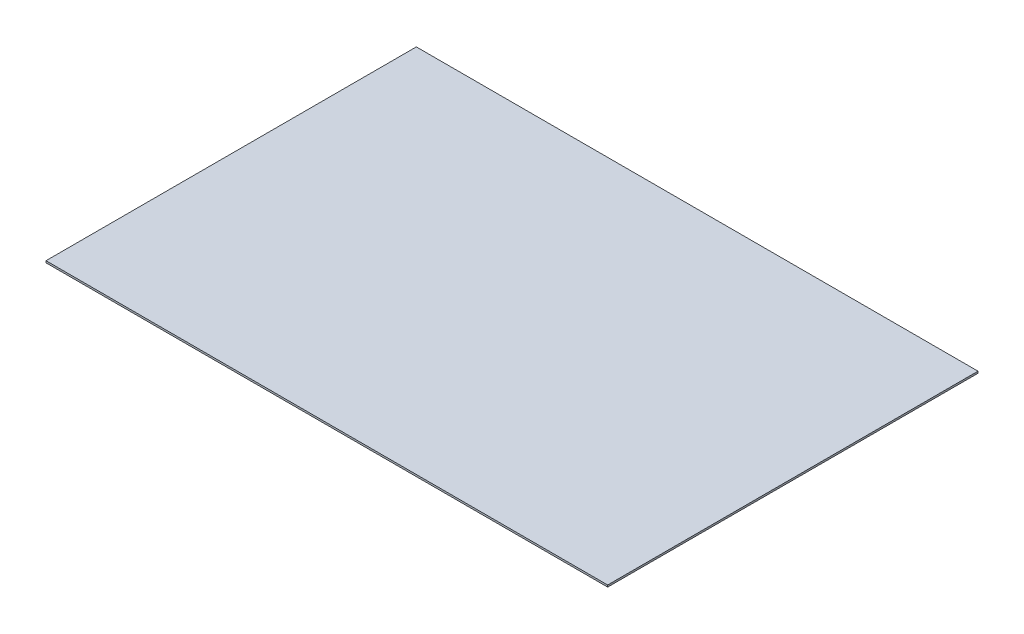
ISO-10303-21;
HEADER;
FILE_DESCRIPTION(('STEP AP214'),'2;1');
FILE_NAME('part.step','',(''),(''),'','','');
FILE_SCHEMA(('AUTOMOTIVE_DESIGN { 1 0 10303 214 1 1 1 1 }'));
ENDSEC;
DATA;
#1=APPLICATION_CONTEXT('core data for automotive mechanical design processes');
#2=APPLICATION_PROTOCOL_DEFINITION('international standard','automotive_design',2000,#1);
#3=PRODUCT_CONTEXT('',#1,'mechanical');
#4=PRODUCT('Part','Part','',(#3));
#5=PRODUCT_RELATED_PRODUCT_CATEGORY('part','',(#4));
#6=PRODUCT_DEFINITION_FORMATION('','',#4);
#7=PRODUCT_DEFINITION_CONTEXT('part definition',#1,'design');
#8=PRODUCT_DEFINITION('design','',#6,#7);
#9=PRODUCT_DEFINITION_SHAPE('','',#8);
#10=(LENGTH_UNIT() NAMED_UNIT(*) SI_UNIT(.MILLI.,.METRE.));
#11=(NAMED_UNIT(*) PLANE_ANGLE_UNIT() SI_UNIT($,.RADIAN.));
#12=(NAMED_UNIT(*) SI_UNIT($,.STERADIAN.) SOLID_ANGLE_UNIT());
#13=UNCERTAINTY_MEASURE_WITH_UNIT(LENGTH_MEASURE(1.E-05),#10,'distance_accuracy_value','');
#14=(GEOMETRIC_REPRESENTATION_CONTEXT(3) GLOBAL_UNCERTAINTY_ASSIGNED_CONTEXT((#13)) GLOBAL_UNIT_ASSIGNED_CONTEXT((#10,
#11,#12)) REPRESENTATION_CONTEXT('',''));
#15=CARTESIAN_POINT('',(0.,0.,0.));
#16=DIRECTION('',(0.,0.,1.));
#17=DIRECTION('',(1.,0.,0.));
#18=AXIS2_PLACEMENT_3D('',#15,#16,#17);
#19=CARTESIAN_POINT('',(-203.947696139477,3.,-347.347447073474));
#20=DIRECTION('',(1.,0.,0.));
#21=DIRECTION('',(0.,0.,-1.));
#22=AXIS2_PLACEMENT_3D('',#19,#20,#21);
#23=PLANE('',#22);
#24=DIRECTION('',(0.,0.,1.));
#25=VECTOR('',#24,1.);
#26=CARTESIAN_POINT('',(-203.947696139477,0.,-347.347447073474));
#27=LINE('',#26,#25);
#28=CARTESIAN_POINT('',(-203.947696139477,0.,-347.347447073474));
#29=VERTEX_POINT('',#28);
#30=CARTESIAN_POINT('',(-203.947696139477,0.,252.652552926525));
#31=VERTEX_POINT('',#30);
#32=EDGE_CURVE('E96',#29,#31,#27,.T.);
#33=ORIENTED_EDGE('',*,*,#32,.T.);
#34=DIRECTION('',(0.,-1.,0.));
#35=VECTOR('',#34,1.);
#36=CARTESIAN_POINT('',(-203.947696139477,3.,252.652552926525));
#37=LINE('',#36,#35);
#38=CARTESIAN_POINT('',(-203.947696139477,3.,252.652552926525));
#39=VERTEX_POINT('',#38);
#40=EDGE_CURVE('E11',#39,#31,#37,.T.);
#41=ORIENTED_EDGE('',*,*,#40,.F.);
#42=DIRECTION('',(0.,0.,1.));
#43=VECTOR('',#42,1.);
#44=CARTESIAN_POINT('',(-203.947696139477,3.,-347.347447073474));
#45=LINE('',#44,#43);
#46=CARTESIAN_POINT('',(-203.947696139477,3.,-347.347447073474));
#47=VERTEX_POINT('',#46);
#48=EDGE_CURVE('E84',#47,#39,#45,.T.);
#49=ORIENTED_EDGE('',*,*,#48,.F.);
#50=DIRECTION('',(0.,-1.,0.));
#51=VECTOR('',#50,1.);
#52=CARTESIAN_POINT('',(-203.947696139477,3.,-347.347447073474));
#53=LINE('',#52,#51);
#54=EDGE_CURVE('E92',#47,#29,#53,.T.);
#55=ORIENTED_EDGE('',*,*,#54,.T.);
#56=EDGE_LOOP('',(#33,#41,#49,#55));
#57=FACE_BOUND('',#56,.T.);
#58=ADVANCED_FACE('F33',(#57),#23,.F.);
#59=CARTESIAN_POINT('',(-203.947696139477,3.,252.652552926525));
#60=DIRECTION('',(0.,0.,-1.));
#61=DIRECTION('',(-1.,0.,0.));
#62=AXIS2_PLACEMENT_3D('',#59,#60,#61);
#63=PLANE('',#62);
#64=DIRECTION('',(1.,0.,0.));
#65=VECTOR('',#64,1.);
#66=CARTESIAN_POINT('',(-203.947696139477,0.,252.652552926525));
#67=LINE('',#66,#65);
#68=CARTESIAN_POINT('',(706.052303860523,0.,252.652552926525));
#69=VERTEX_POINT('',#68);
#70=EDGE_CURVE('E88',#31,#69,#67,.T.);
#71=ORIENTED_EDGE('',*,*,#70,.T.);
#72=DIRECTION('',(0.,-1.,0.));
#73=VECTOR('',#72,1.);
#74=CARTESIAN_POINT('',(706.052303860523,3.,252.652552926525));
#75=LINE('',#74,#73);
#76=CARTESIAN_POINT('',(706.052303860523,3.,252.652552926525));
#77=VERTEX_POINT('',#76);
#78=EDGE_CURVE('E41',#77,#69,#75,.T.);
#79=ORIENTED_EDGE('',*,*,#78,.F.);
#80=DIRECTION('',(1.,0.,0.));
#81=VECTOR('',#80,1.);
#82=CARTESIAN_POINT('',(-203.947696139477,3.,252.652552926525));
#83=LINE('',#82,#81);
#84=EDGE_CURVE('E79',#39,#77,#83,.T.);
#85=ORIENTED_EDGE('',*,*,#84,.F.);
#86=ORIENTED_EDGE('',*,*,#40,.T.);
#87=EDGE_LOOP('',(#71,#79,#85,#86));
#88=FACE_BOUND('',#87,.T.);
#89=ADVANCED_FACE('F87',(#88),#63,.F.);
#90=CARTESIAN_POINT('',(706.052303860523,3.,-347.347447073474));
#91=DIRECTION('',(-1.,0.,0.));
#92=DIRECTION('',(0.,0.,1.));
#93=AXIS2_PLACEMENT_3D('',#90,#91,#92);
#94=PLANE('',#93);
#95=DIRECTION('',(0.,0.,-1.));
#96=VECTOR('',#95,1.);
#97=CARTESIAN_POINT('',(706.052303860523,0.,-347.347447073474));
#98=LINE('',#97,#96);
#99=CARTESIAN_POINT('',(706.052303860523,0.,-347.347447073474));
#100=VERTEX_POINT('',#99);
#101=EDGE_CURVE('E66',#69,#100,#98,.T.);
#102=ORIENTED_EDGE('',*,*,#101,.T.);
#103=DIRECTION('',(0.,-1.,0.));
#104=VECTOR('',#103,1.);
#105=CARTESIAN_POINT('',(706.052303860523,3.,-347.347447073474));
#106=LINE('',#105,#104);
#107=CARTESIAN_POINT('',(706.052303860523,3.,-347.347447073474));
#108=VERTEX_POINT('',#107);
#109=EDGE_CURVE('E89',#108,#100,#106,.T.);
#110=ORIENTED_EDGE('',*,*,#109,.F.);
#111=DIRECTION('',(0.,0.,-1.));
#112=VECTOR('',#111,1.);
#113=CARTESIAN_POINT('',(706.052303860523,3.,-347.347447073474));
#114=LINE('',#113,#112);
#115=EDGE_CURVE('E82',#77,#108,#114,.T.);
#116=ORIENTED_EDGE('',*,*,#115,.F.);
#117=ORIENTED_EDGE('',*,*,#78,.T.);
#118=EDGE_LOOP('',(#102,#110,#116,#117));
#119=FACE_BOUND('',#118,.T.);
#120=ADVANCED_FACE('F90',(#119),#94,.F.);
#121=CARTESIAN_POINT('',(-203.947696139477,3.,-347.347447073474));
#122=DIRECTION('',(0.,0.,1.));
#123=DIRECTION('',(1.,0.,0.));
#124=AXIS2_PLACEMENT_3D('',#121,#122,#123);
#125=PLANE('',#124);
#126=DIRECTION('',(-1.,0.,0.));
#127=VECTOR('',#126,1.);
#128=CARTESIAN_POINT('',(-203.947696139477,0.,-347.347447073474));
#129=LINE('',#128,#127);
#130=EDGE_CURVE('E72',#100,#29,#129,.T.);
#131=ORIENTED_EDGE('',*,*,#130,.T.);
#132=ORIENTED_EDGE('',*,*,#54,.F.);
#133=DIRECTION('',(-1.,0.,0.));
#134=VECTOR('',#133,1.);
#135=CARTESIAN_POINT('',(-203.947696139477,3.,-347.347447073474));
#136=LINE('',#135,#134);
#137=EDGE_CURVE('E49',#108,#47,#136,.T.);
#138=ORIENTED_EDGE('',*,*,#137,.F.);
#139=ORIENTED_EDGE('',*,*,#109,.T.);
#140=EDGE_LOOP('',(#131,#132,#138,#139));
#141=FACE_BOUND('',#140,.T.);
#142=ADVANCED_FACE('F103',(#141),#125,.F.);
#143=CARTESIAN_POINT('',(0.,3.,0.));
#144=DIRECTION('',(0.,1.,0.));
#145=DIRECTION('',(0.,0.,1.));
#146=AXIS2_PLACEMENT_3D('',#143,#144,#145);
#147=PLANE('',#146);
#148=ORIENTED_EDGE('',*,*,#48,.T.);
#149=ORIENTED_EDGE('',*,*,#84,.T.);
#150=ORIENTED_EDGE('',*,*,#115,.T.);
#151=ORIENTED_EDGE('',*,*,#137,.T.);
#152=EDGE_LOOP('',(#148,#149,#150,#151));
#153=FACE_BOUND('',#152,.T.);
#154=ADVANCED_FACE('F80',(#153),#147,.T.);
#155=CARTESIAN_POINT('',(0.,0.,0.));
#156=DIRECTION('',(0.,1.,0.));
#157=DIRECTION('',(0.,0.,1.));
#158=AXIS2_PLACEMENT_3D('',#155,#156,#157);
#159=PLANE('',#158);
#160=ORIENTED_EDGE('',*,*,#32,.F.);
#161=ORIENTED_EDGE('',*,*,#130,.F.);
#162=ORIENTED_EDGE('',*,*,#101,.F.);
#163=ORIENTED_EDGE('',*,*,#70,.F.);
#164=EDGE_LOOP('',(#160,#161,#162,#163));
#165=FACE_BOUND('',#164,.T.);
#166=ADVANCED_FACE('F106',(#165),#159,.F.);
#167=CLOSED_SHELL('',(#58,#89,#120,#142,#154,#166));
#168=MANIFOLD_SOLID_BREP('B2',#167);
#169=ADVANCED_BREP_SHAPE_REPRESENTATION('',(#18,#168),#14);
#170=SHAPE_DEFINITION_REPRESENTATION(#9,#169);
ENDSEC;
END-ISO-10303-21;
